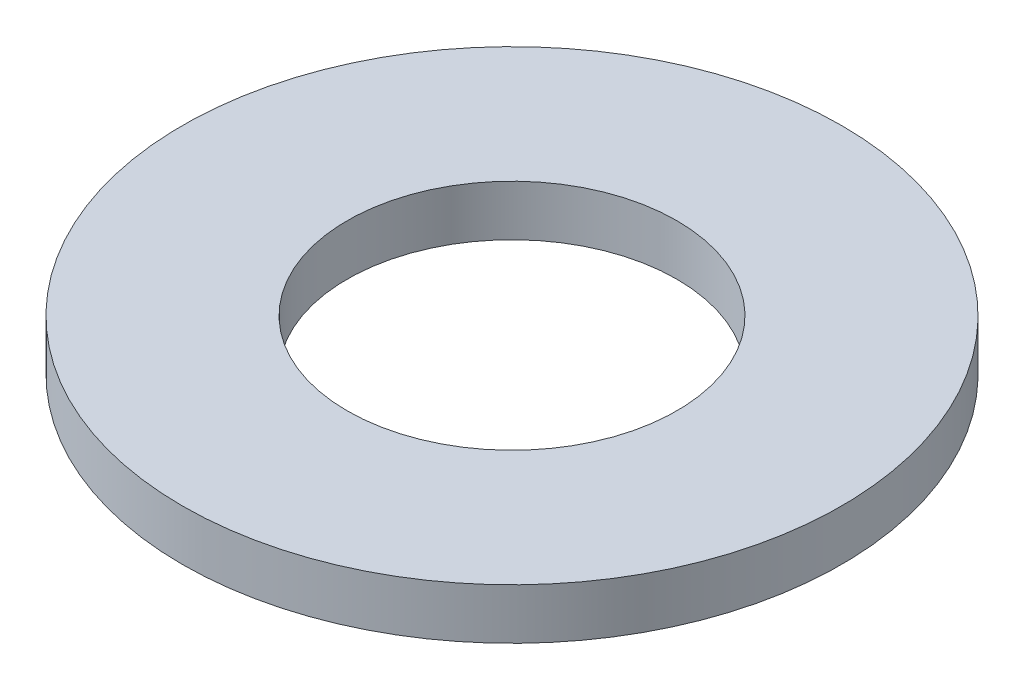
ISO-10303-21;
HEADER;
FILE_DESCRIPTION(('STEP AP214'),'2;1');
FILE_NAME('part.step','',(''),(''),'','','');
FILE_SCHEMA(('AUTOMOTIVE_DESIGN { 1 0 10303 214 1 1 1 1 }'));
ENDSEC;
DATA;
#1=APPLICATION_CONTEXT('core data for automotive mechanical design processes');
#2=APPLICATION_PROTOCOL_DEFINITION('international standard','automotive_design',2000,#1);
#3=PRODUCT_CONTEXT('',#1,'mechanical');
#4=PRODUCT('Part','Part','',(#3));
#5=PRODUCT_RELATED_PRODUCT_CATEGORY('part','',(#4));
#6=PRODUCT_DEFINITION_FORMATION('','',#4);
#7=PRODUCT_DEFINITION_CONTEXT('part definition',#1,'design');
#8=PRODUCT_DEFINITION('design','',#6,#7);
#9=PRODUCT_DEFINITION_SHAPE('','',#8);
#10=(LENGTH_UNIT() NAMED_UNIT(*) SI_UNIT(.MILLI.,.METRE.));
#11=(NAMED_UNIT(*) PLANE_ANGLE_UNIT() SI_UNIT($,.RADIAN.));
#12=(NAMED_UNIT(*) SI_UNIT($,.STERADIAN.) SOLID_ANGLE_UNIT());
#13=UNCERTAINTY_MEASURE_WITH_UNIT(LENGTH_MEASURE(1.E-05),#10,'distance_accuracy_value','');
#14=(GEOMETRIC_REPRESENTATION_CONTEXT(3) GLOBAL_UNCERTAINTY_ASSIGNED_CONTEXT((#13)) GLOBAL_UNIT_ASSIGNED_CONTEXT((#10,
#11,#12)) REPRESENTATION_CONTEXT('',''));
#15=CARTESIAN_POINT('',(0.,0.,0.));
#16=DIRECTION('',(0.,0.,1.));
#17=DIRECTION('',(1.,0.,0.));
#18=AXIS2_PLACEMENT_3D('',#15,#16,#17);
#19=CARTESIAN_POINT('',(0.,1.5875,0.));
#20=DIRECTION('',(0.,1.,0.));
#21=DIRECTION('',(0.,0.,1.));
#22=AXIS2_PLACEMENT_3D('',#19,#20,#21);
#23=PLANE('',#22);
#24=CARTESIAN_POINT('',(0.,1.5875,0.));
#25=DIRECTION('',(0.,1.,0.));
#26=DIRECTION('',(0.,0.,1.));
#27=AXIS2_PLACEMENT_3D('',#24,#25,#26);
#28=CIRCLE('',#27,10.31875);
#29=CARTESIAN_POINT('',(0.,1.5875,10.31875));
#30=VERTEX_POINT('',#29);
#31=EDGE_CURVE('E10',#30,#30,#28,.T.);
#32=ORIENTED_EDGE('',*,*,#31,.T.);
#33=EDGE_LOOP('',(#32));
#34=FACE_BOUND('',#33,.T.);
#35=CARTESIAN_POINT('',(0.,1.5875,0.));
#36=DIRECTION('',(0.,1.,0.));
#37=DIRECTION('',(0.,0.,1.));
#38=AXIS2_PLACEMENT_3D('',#35,#36,#37);
#39=CIRCLE('',#38,5.159375);
#40=CARTESIAN_POINT('',(0.,1.5875,5.159375));
#41=VERTEX_POINT('',#40);
#42=EDGE_CURVE('E46',#41,#41,#39,.T.);
#43=ORIENTED_EDGE('',*,*,#42,.F.);
#44=EDGE_LOOP('',(#43));
#45=FACE_BOUND('',#44,.T.);
#46=ADVANCED_FACE('F35',(#34,#45),#23,.T.);
#47=CARTESIAN_POINT('',(0.,0.,0.));
#48=DIRECTION('',(0.,1.,0.));
#49=DIRECTION('',(0.,0.,1.));
#50=AXIS2_PLACEMENT_3D('',#47,#48,#49);
#51=PLANE('',#50);
#52=CARTESIAN_POINT('',(0.,0.,0.));
#53=DIRECTION('',(0.,1.,0.));
#54=DIRECTION('',(0.,0.,1.));
#55=AXIS2_PLACEMENT_3D('',#52,#53,#54);
#56=CIRCLE('',#55,10.31875);
#57=CARTESIAN_POINT('',(0.,0.,10.31875));
#58=VERTEX_POINT('',#57);
#59=EDGE_CURVE('E39',#58,#58,#56,.T.);
#60=ORIENTED_EDGE('',*,*,#59,.F.);
#61=EDGE_LOOP('',(#60));
#62=FACE_BOUND('',#61,.T.);
#63=CARTESIAN_POINT('',(0.,0.,0.));
#64=DIRECTION('',(0.,1.,0.));
#65=DIRECTION('',(0.,0.,1.));
#66=AXIS2_PLACEMENT_3D('',#63,#64,#65);
#67=CIRCLE('',#66,5.159375);
#68=CARTESIAN_POINT('',(0.,0.,5.159375));
#69=VERTEX_POINT('',#68);
#70=EDGE_CURVE('E48',#69,#69,#67,.T.);
#71=ORIENTED_EDGE('',*,*,#70,.T.);
#72=EDGE_LOOP('',(#71));
#73=FACE_BOUND('',#72,.T.);
#74=ADVANCED_FACE('F58',(#62,#73),#51,.F.);
#75=CARTESIAN_POINT('',(0.,1.5875,0.));
#76=DIRECTION('',(0.,-1.,0.));
#77=DIRECTION('',(0.,0.,-1.));
#78=AXIS2_PLACEMENT_3D('',#75,#76,#77);
#79=CYLINDRICAL_SURFACE('',#78,10.31875);
#80=ORIENTED_EDGE('',*,*,#31,.F.);
#81=EDGE_LOOP('',(#80));
#82=FACE_BOUND('',#81,.T.);
#83=ORIENTED_EDGE('',*,*,#59,.T.);
#84=EDGE_LOOP('',(#83));
#85=FACE_BOUND('',#84,.T.);
#86=ADVANCED_FACE('F37',(#82,#85),#79,.T.);
#87=CARTESIAN_POINT('',(0.,1.5875,0.));
#88=DIRECTION('',(0.,-1.,0.));
#89=DIRECTION('',(0.,0.,-1.));
#90=AXIS2_PLACEMENT_3D('',#87,#88,#89);
#91=CYLINDRICAL_SURFACE('',#90,5.159375);
#92=ORIENTED_EDGE('',*,*,#42,.T.);
#93=EDGE_LOOP('',(#92));
#94=FACE_BOUND('',#93,.T.);
#95=ORIENTED_EDGE('',*,*,#70,.F.);
#96=EDGE_LOOP('',(#95));
#97=FACE_BOUND('',#96,.T.);
#98=ADVANCED_FACE('F54',(#94,#97),#91,.F.);
#99=CLOSED_SHELL('',(#46,#74,#86,#98));
#100=MANIFOLD_SOLID_BREP('B2',#99);
#101=ADVANCED_BREP_SHAPE_REPRESENTATION('',(#18,#100),#14);
#102=SHAPE_DEFINITION_REPRESENTATION(#9,#101);
ENDSEC;
END-ISO-10303-21;
